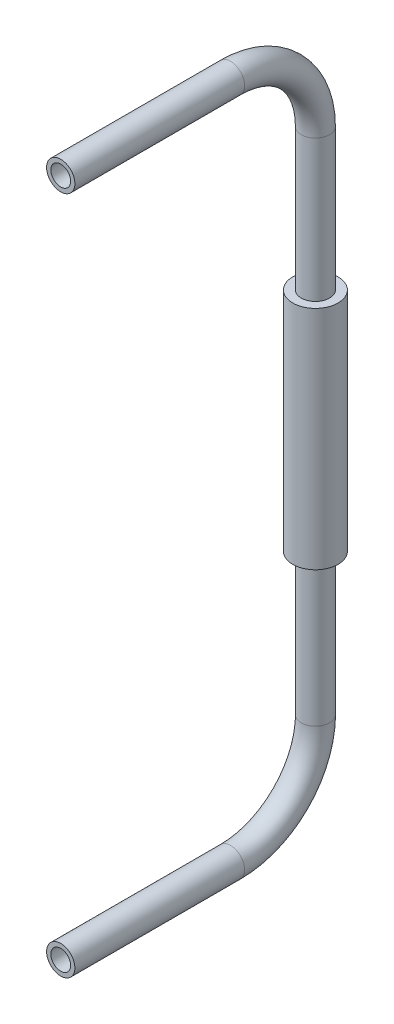
ISO-10303-21;
HEADER;
FILE_DESCRIPTION(('STEP AP214'),'2;1');
FILE_NAME('part.step','',(''),(''),'','','');
FILE_SCHEMA(('AUTOMOTIVE_DESIGN { 1 0 10303 214 1 1 1 1 }'));
ENDSEC;
DATA;
#1=APPLICATION_CONTEXT('core data for automotive mechanical design processes');
#2=APPLICATION_PROTOCOL_DEFINITION('international standard','automotive_design',2000,#1);
#3=PRODUCT_CONTEXT('',#1,'mechanical');
#4=PRODUCT('Part','Part','',(#3));
#5=PRODUCT_RELATED_PRODUCT_CATEGORY('part','',(#4));
#6=PRODUCT_DEFINITION_FORMATION('','',#4);
#7=PRODUCT_DEFINITION_CONTEXT('part definition',#1,'design');
#8=PRODUCT_DEFINITION('design','',#6,#7);
#9=PRODUCT_DEFINITION_SHAPE('','',#8);
#10=(LENGTH_UNIT() NAMED_UNIT(*) SI_UNIT(.MILLI.,.METRE.));
#11=(NAMED_UNIT(*) PLANE_ANGLE_UNIT() SI_UNIT($,.RADIAN.));
#12=(NAMED_UNIT(*) SI_UNIT($,.STERADIAN.) SOLID_ANGLE_UNIT());
#13=UNCERTAINTY_MEASURE_WITH_UNIT(LENGTH_MEASURE(1.E-05),#10,'distance_accuracy_value','');
#14=(GEOMETRIC_REPRESENTATION_CONTEXT(3) GLOBAL_UNCERTAINTY_ASSIGNED_CONTEXT((#13)) GLOBAL_UNIT_ASSIGNED_CONTEXT((#10,
#11,#12)) REPRESENTATION_CONTEXT('',''));
#15=CARTESIAN_POINT('',(0.,0.,0.));
#16=DIRECTION('',(0.,0.,1.));
#17=DIRECTION('',(1.,0.,0.));
#18=AXIS2_PLACEMENT_3D('',#15,#16,#17);
#19=CARTESIAN_POINT('',(0.,-22.5,0.));
#20=DIRECTION('',(0.,1.,0.));
#21=DIRECTION('',(0.,0.,1.));
#22=AXIS2_PLACEMENT_3D('',#19,#20,#21);
#23=CYLINDRICAL_SURFACE('',#22,1.75);
#24=CARTESIAN_POINT('',(0.,45.,0.));
#25=DIRECTION('',(0.,1.,0.));
#26=DIRECTION('',(0.,0.,-1.));
#27=AXIS2_PLACEMENT_3D('',#24,#25,#26);
#28=CIRCLE('',#27,1.75);
#29=CARTESIAN_POINT('',(0.,45.,-1.75));
#30=VERTEX_POINT('',#29);
#31=EDGE_CURVE('E84',#30,#30,#28,.T.);
#32=ORIENTED_EDGE('',*,*,#31,.T.);
#33=EDGE_LOOP('',(#32));
#34=FACE_BOUND('',#33,.T.);
#35=CARTESIAN_POINT('',(0.,-45.,0.));
#36=DIRECTION('',(0.,1.,0.));
#37=DIRECTION('',(0.,0.,-1.));
#38=AXIS2_PLACEMENT_3D('',#35,#36,#37);
#39=CIRCLE('',#38,1.75);
#40=CARTESIAN_POINT('',(0.,-45.,-1.75));
#41=VERTEX_POINT('',#40);
#42=EDGE_CURVE('E59',#41,#41,#39,.F.);
#43=ORIENTED_EDGE('',*,*,#42,.T.);
#44=EDGE_LOOP('',(#43));
#45=FACE_BOUND('',#44,.T.);
#46=ADVANCED_FACE('F15',(#34,#45),#23,.F.);
#47=CARTESIAN_POINT('',(0.,45.,15.));
#48=DIRECTION('',(1.,0.,0.));
#49=DIRECTION('',(0.,0.,-1.));
#50=AXIS2_PLACEMENT_3D('',#47,#48,#49);
#51=TOROIDAL_SURFACE('',#50,15.,1.75);
#52=ORIENTED_EDGE('',*,*,#31,.F.);
#53=EDGE_LOOP('',(#52));
#54=FACE_BOUND('',#53,.T.);
#55=CARTESIAN_POINT('',(0.,60.,15.));
#56=DIRECTION('',(0.,0.,1.));
#57=DIRECTION('',(1.,0.,0.));
#58=AXIS2_PLACEMENT_3D('',#55,#56,#57);
#59=CIRCLE('',#58,1.75);
#60=CARTESIAN_POINT('',(1.75,60.,15.));
#61=VERTEX_POINT('',#60);
#62=EDGE_CURVE('E54',#61,#61,#59,.T.);
#63=ORIENTED_EDGE('',*,*,#62,.T.);
#64=EDGE_LOOP('',(#63));
#65=FACE_BOUND('',#64,.T.);
#66=ADVANCED_FACE('F77',(#54,#65),#51,.F.);
#67=CARTESIAN_POINT('',(0.,-45.,15.));
#68=DIRECTION('',(1.,0.,0.));
#69=DIRECTION('',(0.,0.,-1.));
#70=AXIS2_PLACEMENT_3D('',#67,#68,#69);
#71=TOROIDAL_SURFACE('',#70,15.,1.75);
#72=CARTESIAN_POINT('',(0.,-60.,15.));
#73=DIRECTION('',(0.,0.,-1.));
#74=DIRECTION('',(-1.,0.,0.));
#75=AXIS2_PLACEMENT_3D('',#72,#73,#74);
#76=CIRCLE('',#75,1.75);
#77=CARTESIAN_POINT('',(-1.75,-60.,15.));
#78=VERTEX_POINT('',#77);
#79=EDGE_CURVE('E50',#78,#78,#76,.F.);
#80=ORIENTED_EDGE('',*,*,#79,.T.);
#81=EDGE_LOOP('',(#80));
#82=FACE_BOUND('',#81,.T.);
#83=ORIENTED_EDGE('',*,*,#42,.F.);
#84=EDGE_LOOP('',(#83));
#85=FACE_BOUND('',#84,.T.);
#86=ADVANCED_FACE('F73',(#82,#85),#71,.F.);
#87=CARTESIAN_POINT('',(0.,60.,30.));
#88=DIRECTION('',(0.,0.,1.));
#89=DIRECTION('',(1.,0.,0.));
#90=AXIS2_PLACEMENT_3D('',#87,#88,#89);
#91=CYLINDRICAL_SURFACE('',#90,1.75);
#92=ORIENTED_EDGE('',*,*,#62,.F.);
#93=EDGE_LOOP('',(#92));
#94=FACE_BOUND('',#93,.T.);
#95=CARTESIAN_POINT('',(0.,60.,45.));
#96=DIRECTION('',(0.,0.,1.));
#97=DIRECTION('',(1.,0.,0.));
#98=AXIS2_PLACEMENT_3D('',#95,#96,#97);
#99=CIRCLE('',#98,1.75);
#100=CARTESIAN_POINT('',(1.75,60.,45.));
#101=VERTEX_POINT('',#100);
#102=EDGE_CURVE('E18',#101,#101,#99,.F.);
#103=ORIENTED_EDGE('',*,*,#102,.F.);
#104=EDGE_LOOP('',(#103));
#105=FACE_BOUND('',#104,.T.);
#106=ADVANCED_FACE('F76',(#94,#105),#91,.F.);
#107=CARTESIAN_POINT('',(0.,-60.,30.));
#108=DIRECTION('',(0.,0.,-1.));
#109=DIRECTION('',(-1.,0.,0.));
#110=AXIS2_PLACEMENT_3D('',#107,#108,#109);
#111=CYLINDRICAL_SURFACE('',#110,1.75);
#112=ORIENTED_EDGE('',*,*,#79,.F.);
#113=EDGE_LOOP('',(#112));
#114=FACE_BOUND('',#113,.T.);
#115=CARTESIAN_POINT('',(0.,-60.,45.));
#116=DIRECTION('',(0.,0.,-1.));
#117=DIRECTION('',(-1.,0.,0.));
#118=AXIS2_PLACEMENT_3D('',#115,#116,#117);
#119=CIRCLE('',#118,1.75);
#120=CARTESIAN_POINT('',(-1.75,-60.,45.));
#121=VERTEX_POINT('',#120);
#122=EDGE_CURVE('E45',#121,#121,#119,.T.);
#123=ORIENTED_EDGE('',*,*,#122,.F.);
#124=EDGE_LOOP('',(#123));
#125=FACE_BOUND('',#124,.T.);
#126=ADVANCED_FACE('F152',(#114,#125),#111,.F.);
#127=CARTESIAN_POINT('',(0.,0.,45.));
#128=DIRECTION('',(0.,0.,1.));
#129=DIRECTION('',(1.,0.,0.));
#130=AXIS2_PLACEMENT_3D('',#127,#128,#129);
#131=PLANE('',#130);
#132=ORIENTED_EDGE('',*,*,#102,.T.);
#133=EDGE_LOOP('',(#132));
#134=FACE_BOUND('',#133,.T.);
#135=CARTESIAN_POINT('',(0.,60.,45.));
#136=DIRECTION('',(0.,0.,1.));
#137=DIRECTION('',(1.,0.,0.));
#138=AXIS2_PLACEMENT_3D('',#135,#136,#137);
#139=CIRCLE('',#138,2.5);
#140=CARTESIAN_POINT('',(2.5,60.,45.));
#141=VERTEX_POINT('',#140);
#142=EDGE_CURVE('E43',#141,#141,#139,.F.);
#143=ORIENTED_EDGE('',*,*,#142,.F.);
#144=EDGE_LOOP('',(#143));
#145=FACE_BOUND('',#144,.T.);
#146=ADVANCED_FACE('F150',(#134,#145),#131,.T.);
#147=CARTESIAN_POINT('',(0.,0.,45.));
#148=DIRECTION('',(0.,0.,1.));
#149=DIRECTION('',(1.,0.,0.));
#150=AXIS2_PLACEMENT_3D('',#147,#148,#149);
#151=PLANE('',#150);
#152=ORIENTED_EDGE('',*,*,#122,.T.);
#153=EDGE_LOOP('',(#152));
#154=FACE_BOUND('',#153,.T.);
#155=CARTESIAN_POINT('',(0.,-60.,45.));
#156=DIRECTION('',(0.,0.,-1.));
#157=DIRECTION('',(-1.,0.,0.));
#158=AXIS2_PLACEMENT_3D('',#155,#156,#157);
#159=CIRCLE('',#158,2.5);
#160=CARTESIAN_POINT('',(-2.5,-60.,45.));
#161=VERTEX_POINT('',#160);
#162=EDGE_CURVE('E39',#161,#161,#159,.T.);
#163=ORIENTED_EDGE('',*,*,#162,.F.);
#164=EDGE_LOOP('',(#163));
#165=FACE_BOUND('',#164,.T.);
#166=ADVANCED_FACE('F146',(#154,#165),#151,.T.);
#167=CARTESIAN_POINT('',(0.,60.,30.));
#168=DIRECTION('',(0.,0.,1.));
#169=DIRECTION('',(1.,0.,0.));
#170=AXIS2_PLACEMENT_3D('',#167,#168,#169);
#171=CYLINDRICAL_SURFACE('',#170,2.5);
#172=CARTESIAN_POINT('',(0.,60.,15.));
#173=DIRECTION('',(0.,0.,1.));
#174=DIRECTION('',(0.,1.,0.));
#175=AXIS2_PLACEMENT_3D('',#172,#173,#174);
#176=CIRCLE('',#175,2.5);
#177=CARTESIAN_POINT('',(0.,62.5,15.));
#178=VERTEX_POINT('',#177);
#179=EDGE_CURVE('E42',#178,#178,#176,.F.);
#180=ORIENTED_EDGE('',*,*,#179,.F.);
#181=EDGE_LOOP('',(#180));
#182=FACE_BOUND('',#181,.T.);
#183=ORIENTED_EDGE('',*,*,#142,.T.);
#184=EDGE_LOOP('',(#183));
#185=FACE_BOUND('',#184,.T.);
#186=ADVANCED_FACE('F142',(#182,#185),#171,.T.);
#187=CARTESIAN_POINT('',(0.,-60.,30.));
#188=DIRECTION('',(0.,0.,-1.));
#189=DIRECTION('',(-1.,0.,0.));
#190=AXIS2_PLACEMENT_3D('',#187,#188,#189);
#191=CYLINDRICAL_SURFACE('',#190,2.5);
#192=CARTESIAN_POINT('',(0.,-60.,15.));
#193=DIRECTION('',(0.,0.,-1.));
#194=DIRECTION('',(0.,-1.,0.));
#195=AXIS2_PLACEMENT_3D('',#192,#193,#194);
#196=CIRCLE('',#195,2.5);
#197=CARTESIAN_POINT('',(0.,-62.5,15.));
#198=VERTEX_POINT('',#197);
#199=EDGE_CURVE('E132',#198,#198,#196,.T.);
#200=ORIENTED_EDGE('',*,*,#199,.F.);
#201=EDGE_LOOP('',(#200));
#202=FACE_BOUND('',#201,.T.);
#203=ORIENTED_EDGE('',*,*,#162,.T.);
#204=EDGE_LOOP('',(#203));
#205=FACE_BOUND('',#204,.T.);
#206=ADVANCED_FACE('F145',(#202,#205),#191,.T.);
#207=CARTESIAN_POINT('',(0.,45.,15.));
#208=DIRECTION('',(1.,0.,0.));
#209=DIRECTION('',(0.,0.,-1.));
#210=AXIS2_PLACEMENT_3D('',#207,#208,#209);
#211=TOROIDAL_SURFACE('',#210,15.,2.5);
#212=CARTESIAN_POINT('',(0.,45.,0.));
#213=DIRECTION('',(0.,1.,0.));
#214=DIRECTION('',(0.,0.,1.));
#215=AXIS2_PLACEMENT_3D('',#212,#213,#214);
#216=CIRCLE('',#215,2.5);
#217=CARTESIAN_POINT('',(0.,45.,2.5));
#218=VERTEX_POINT('',#217);
#219=EDGE_CURVE('E135',#218,#218,#216,.F.);
#220=ORIENTED_EDGE('',*,*,#219,.F.);
#221=EDGE_LOOP('',(#220));
#222=FACE_BOUND('',#221,.T.);
#223=ORIENTED_EDGE('',*,*,#179,.T.);
#224=EDGE_LOOP('',(#223));
#225=FACE_BOUND('',#224,.T.);
#226=ADVANCED_FACE('F123',(#222,#225),#211,.T.);
#227=CARTESIAN_POINT('',(0.,-45.,15.));
#228=DIRECTION('',(1.,0.,0.));
#229=DIRECTION('',(0.,0.,-1.));
#230=AXIS2_PLACEMENT_3D('',#227,#228,#229);
#231=TOROIDAL_SURFACE('',#230,15.,2.5);
#232=ORIENTED_EDGE('',*,*,#199,.T.);
#233=EDGE_LOOP('',(#232));
#234=FACE_BOUND('',#233,.T.);
#235=CARTESIAN_POINT('',(0.,-45.,0.));
#236=DIRECTION('',(0.,1.,0.));
#237=DIRECTION('',(0.,0.,1.));
#238=AXIS2_PLACEMENT_3D('',#235,#236,#237);
#239=CIRCLE('',#238,2.5);
#240=CARTESIAN_POINT('',(0.,-45.,2.5));
#241=VERTEX_POINT('',#240);
#242=EDGE_CURVE('E38',#241,#241,#239,.T.);
#243=ORIENTED_EDGE('',*,*,#242,.F.);
#244=EDGE_LOOP('',(#243));
#245=FACE_BOUND('',#244,.T.);
#246=ADVANCED_FACE('F118',(#234,#245),#231,.T.);
#247=CARTESIAN_POINT('',(0.,-22.5,0.));
#248=DIRECTION('',(0.,1.,0.));
#249=DIRECTION('',(0.,0.,1.));
#250=AXIS2_PLACEMENT_3D('',#247,#248,#249);
#251=CYLINDRICAL_SURFACE('',#250,2.5);
#252=ORIENTED_EDGE('',*,*,#219,.T.);
#253=EDGE_LOOP('',(#252));
#254=FACE_BOUND('',#253,.T.);
#255=CARTESIAN_POINT('',(0.,20.,0.));
#256=DIRECTION('',(0.,1.,0.));
#257=DIRECTION('',(0.,0.,1.));
#258=AXIS2_PLACEMENT_3D('',#255,#256,#257);
#259=CIRCLE('',#258,2.5);
#260=CARTESIAN_POINT('',(0.,20.,2.5));
#261=VERTEX_POINT('',#260);
#262=EDGE_CURVE('E35',#261,#261,#259,.F.);
#263=ORIENTED_EDGE('',*,*,#262,.F.);
#264=EDGE_LOOP('',(#263));
#265=FACE_BOUND('',#264,.T.);
#266=ADVANCED_FACE('F114',(#254,#265),#251,.T.);
#267=CARTESIAN_POINT('',(0.,-22.5,0.));
#268=DIRECTION('',(0.,1.,0.));
#269=DIRECTION('',(0.,0.,1.));
#270=AXIS2_PLACEMENT_3D('',#267,#268,#269);
#271=CYLINDRICAL_SURFACE('',#270,2.5);
#272=ORIENTED_EDGE('',*,*,#242,.T.);
#273=EDGE_LOOP('',(#272));
#274=FACE_BOUND('',#273,.T.);
#275=CARTESIAN_POINT('',(0.,-20.,0.));
#276=DIRECTION('',(0.,1.,0.));
#277=DIRECTION('',(0.,0.,1.));
#278=AXIS2_PLACEMENT_3D('',#275,#276,#277);
#279=CIRCLE('',#278,2.5);
#280=CARTESIAN_POINT('',(0.,-20.,2.5));
#281=VERTEX_POINT('',#280);
#282=EDGE_CURVE('E27',#281,#281,#279,.F.);
#283=ORIENTED_EDGE('',*,*,#282,.T.);
#284=EDGE_LOOP('',(#283));
#285=FACE_BOUND('',#284,.T.);
#286=ADVANCED_FACE('F110',(#274,#285),#271,.T.);
#287=CARTESIAN_POINT('',(0.,20.,0.));
#288=DIRECTION('',(0.,1.,0.));
#289=DIRECTION('',(0.,0.,1.));
#290=AXIS2_PLACEMENT_3D('',#287,#288,#289);
#291=PLANE('',#290);
#292=ORIENTED_EDGE('',*,*,#262,.T.);
#293=EDGE_LOOP('',(#292));
#294=FACE_BOUND('',#293,.T.);
#295=CARTESIAN_POINT('',(0.,20.,0.));
#296=DIRECTION('',(0.,1.,0.));
#297=DIRECTION('',(0.,0.,1.));
#298=AXIS2_PLACEMENT_3D('',#295,#296,#297);
#299=CIRCLE('',#298,4.);
#300=CARTESIAN_POINT('',(0.,20.,4.));
#301=VERTEX_POINT('',#300);
#302=EDGE_CURVE('E22',#301,#301,#299,.F.);
#303=ORIENTED_EDGE('',*,*,#302,.F.);
#304=EDGE_LOOP('',(#303));
#305=FACE_BOUND('',#304,.T.);
#306=ADVANCED_FACE('F103',(#294,#305),#291,.T.);
#307=CARTESIAN_POINT('',(0.,-20.,0.));
#308=DIRECTION('',(0.,1.,0.));
#309=DIRECTION('',(0.,0.,1.));
#310=AXIS2_PLACEMENT_3D('',#307,#308,#309);
#311=PLANE('',#310);
#312=ORIENTED_EDGE('',*,*,#282,.F.);
#313=EDGE_LOOP('',(#312));
#314=FACE_BOUND('',#313,.T.);
#315=CARTESIAN_POINT('',(0.,-20.,0.));
#316=DIRECTION('',(0.,1.,0.));
#317=DIRECTION('',(0.,0.,1.));
#318=AXIS2_PLACEMENT_3D('',#315,#316,#317);
#319=CIRCLE('',#318,4.);
#320=CARTESIAN_POINT('',(0.,-20.,4.));
#321=VERTEX_POINT('',#320);
#322=EDGE_CURVE('E10',#321,#321,#319,.T.);
#323=ORIENTED_EDGE('',*,*,#322,.F.);
#324=EDGE_LOOP('',(#323));
#325=FACE_BOUND('',#324,.T.);
#326=ADVANCED_FACE('F98',(#314,#325),#311,.F.);
#327=CARTESIAN_POINT('',(0.,0.,0.));
#328=DIRECTION('',(0.,1.,0.));
#329=DIRECTION('',(0.,0.,1.));
#330=AXIS2_PLACEMENT_3D('',#327,#328,#329);
#331=CYLINDRICAL_SURFACE('',#330,4.);
#332=ORIENTED_EDGE('',*,*,#322,.T.);
#333=EDGE_LOOP('',(#332));
#334=FACE_BOUND('',#333,.T.);
#335=ORIENTED_EDGE('',*,*,#302,.T.);
#336=EDGE_LOOP('',(#335));
#337=FACE_BOUND('',#336,.T.);
#338=ADVANCED_FACE('F96',(#334,#337),#331,.T.);
#339=CLOSED_SHELL('',(#46,#66,#86,#106,#126,#146,#166,#186,#206,#226,#246,#266,#286,#306,#326,#338));
#340=MANIFOLD_SOLID_BREP('B1',#339);
#341=ADVANCED_BREP_SHAPE_REPRESENTATION('',(#18,#340),#14);
#342=SHAPE_DEFINITION_REPRESENTATION(#9,#341);
ENDSEC;
END-ISO-10303-21;
